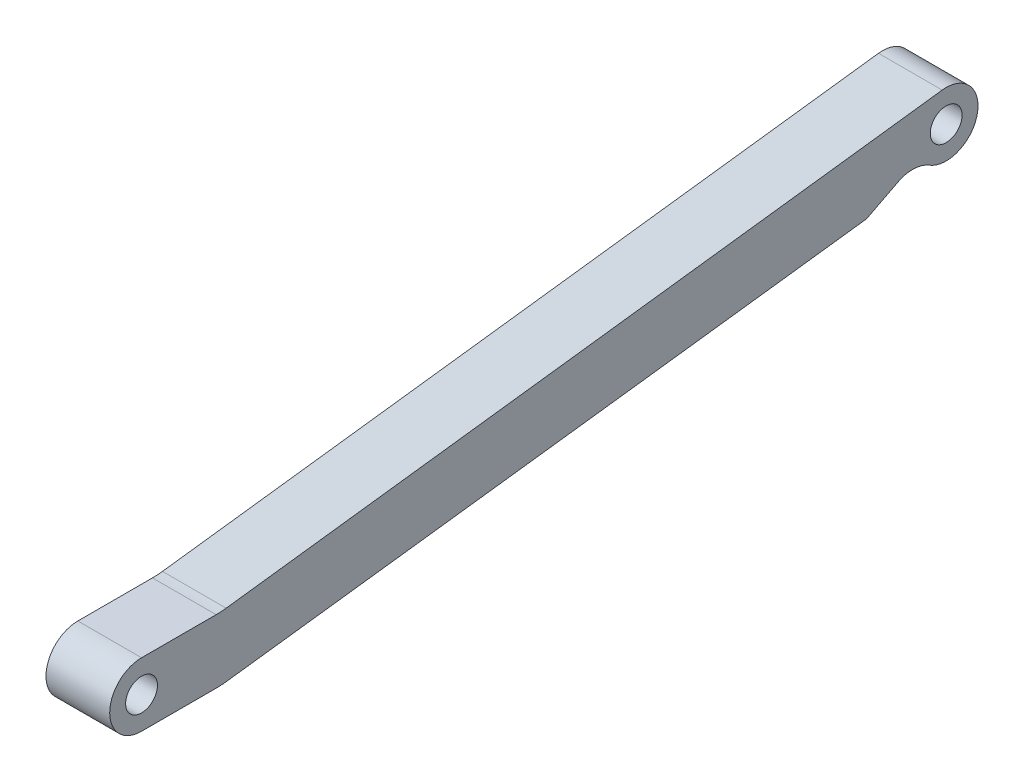
ISO-10303-21;
HEADER;
FILE_DESCRIPTION(('STEP AP214'),'2;1');
FILE_NAME('part.step','',(''),(''),'','','');
FILE_SCHEMA(('AUTOMOTIVE_DESIGN { 1 0 10303 214 1 1 1 1 }'));
ENDSEC;
DATA;
#1=APPLICATION_CONTEXT('core data for automotive mechanical design processes');
#2=APPLICATION_PROTOCOL_DEFINITION('international standard','automotive_design',2000,#1);
#3=PRODUCT_CONTEXT('',#1,'mechanical');
#4=PRODUCT('Part','Part','',(#3));
#5=PRODUCT_RELATED_PRODUCT_CATEGORY('part','',(#4));
#6=PRODUCT_DEFINITION_FORMATION('','',#4);
#7=PRODUCT_DEFINITION_CONTEXT('part definition',#1,'design');
#8=PRODUCT_DEFINITION('design','',#6,#7);
#9=PRODUCT_DEFINITION_SHAPE('','',#8);
#10=(LENGTH_UNIT() NAMED_UNIT(*) SI_UNIT(.MILLI.,.METRE.));
#11=(NAMED_UNIT(*) PLANE_ANGLE_UNIT() SI_UNIT($,.RADIAN.));
#12=(NAMED_UNIT(*) SI_UNIT($,.STERADIAN.) SOLID_ANGLE_UNIT());
#13=UNCERTAINTY_MEASURE_WITH_UNIT(LENGTH_MEASURE(1.E-05),#10,'distance_accuracy_value','');
#14=(GEOMETRIC_REPRESENTATION_CONTEXT(3) GLOBAL_UNCERTAINTY_ASSIGNED_CONTEXT((#13)) GLOBAL_UNIT_ASSIGNED_CONTEXT((#10,
#11,#12)) REPRESENTATION_CONTEXT('',''));
#15=CARTESIAN_POINT('',(0.,0.,0.));
#16=DIRECTION('',(0.,0.,1.));
#17=DIRECTION('',(1.,0.,0.));
#18=AXIS2_PLACEMENT_3D('',#15,#16,#17);
#19=CARTESIAN_POINT('',(-2.,-1.6545990799385,-48.4277662077511));
#20=DIRECTION('',(1.,0.,0.));
#21=DIRECTION('',(0.,0.,-1.));
#22=AXIS2_PLACEMENT_3D('',#19,#20,#21);
#23=CYLINDRICAL_SURFACE('',#22,2.);
#24=DIRECTION('',(1.,0.,0.));
#25=VECTOR('',#24,1.);
#26=CARTESIAN_POINT('',(-2.,0.0477004600307523,-49.4776120422528));
#27=LINE('',#26,#25);
#28=CARTESIAN_POINT('',(-2.,0.0477004600307523,-49.4776120422528));
#29=VERTEX_POINT('',#28);
#30=CARTESIAN_POINT('',(2.,0.0477004600307523,-49.4776120422528));
#31=VERTEX_POINT('',#30);
#32=EDGE_CURVE('E42',#29,#31,#27,.T.);
#33=ORIENTED_EDGE('',*,*,#32,.T.);
#34=CARTESIAN_POINT('',(2.,-1.6545990799385,-48.4277662077511));
#35=DIRECTION('',(1.,0.,0.));
#36=DIRECTION('',(0.,0.,-1.));
#37=AXIS2_PLACEMENT_3D('',#34,#35,#36);
#38=CIRCLE('',#37,2.);
#39=CARTESIAN_POINT('',(2.,0.124574628471132,-47.5142340981327));
#40=VERTEX_POINT('',#39);
#41=EDGE_CURVE('E119',#31,#40,#38,.T.);
#42=ORIENTED_EDGE('',*,*,#41,.T.);
#43=DIRECTION('',(1.,0.,0.));
#44=VECTOR('',#43,1.);
#45=CARTESIAN_POINT('',(-2.,0.124574628471132,-47.5142340981327));
#46=LINE('',#45,#44);
#47=CARTESIAN_POINT('',(-2.,0.124574628471132,-47.5142340981327));
#48=VERTEX_POINT('',#47);
#49=EDGE_CURVE('E11',#48,#40,#46,.T.);
#50=ORIENTED_EDGE('',*,*,#49,.F.);
#51=CARTESIAN_POINT('',(-2.,-1.6545990799385,-48.4277662077511));
#52=DIRECTION('',(1.,0.,0.));
#53=DIRECTION('',(0.,0.,-1.));
#54=AXIS2_PLACEMENT_3D('',#51,#52,#53);
#55=CIRCLE('',#54,2.);
#56=EDGE_CURVE('E55',#29,#48,#55,.T.);
#57=ORIENTED_EDGE('',*,*,#56,.F.);
#58=EDGE_LOOP('',(#33,#42,#50,#57));
#59=FACE_BOUND('',#58,.T.);
#60=ADVANCED_FACE('F39',(#59),#23,.F.);
#61=CARTESIAN_POINT('',(-2.,-19.2080210083008,-9.86252431135217));
#62=DIRECTION('',(0.,-0.889586854204813,-0.456766054809225));
#63=DIRECTION('',(0.,0.456766054809225,-0.889586854204813));
#64=AXIS2_PLACEMENT_3D('',#61,#62,#63);
#65=PLANE('',#64);
#66=ORIENTED_EDGE('',*,*,#49,.T.);
#67=DIRECTION('',(0.,0.456766054809225,-0.889586854204813));
#68=VECTOR('',#67,1.);
#69=CARTESIAN_POINT('',(2.,-19.2080210083008,-9.86252431135217));
#70=LINE('',#69,#68);
#71=CARTESIAN_POINT('',(2.,-0.895552784763757,-45.5274578767545));
#72=VERTEX_POINT('',#71);
#73=EDGE_CURVE('E137',#72,#40,#70,.T.);
#74=ORIENTED_EDGE('',*,*,#73,.F.);
#75=DIRECTION('',(1.,0.,0.));
#76=VECTOR('',#75,1.);
#77=CARTESIAN_POINT('',(-2.,-0.895552784763757,-45.5274578767545));
#78=LINE('',#77,#76);
#79=CARTESIAN_POINT('',(-2.,-0.895552784763757,-45.5274578767545));
#80=VERTEX_POINT('',#79);
#81=EDGE_CURVE('E47',#80,#72,#78,.T.);
#82=ORIENTED_EDGE('',*,*,#81,.F.);
#83=DIRECTION('',(0.,0.456766054809225,-0.889586854204813));
#84=VECTOR('',#83,1.);
#85=CARTESIAN_POINT('',(-2.,-19.2080210083008,-9.86252431135217));
#86=LINE('',#85,#84);
#87=EDGE_CURVE('E185',#80,#48,#86,.T.);
#88=ORIENTED_EDGE('',*,*,#87,.T.);
#89=EDGE_LOOP('',(#66,#74,#82,#88));
#90=FACE_BOUND('',#89,.T.);
#91=ADVANCED_FACE('F234',(#90),#65,.T.);
#92=CARTESIAN_POINT('',(-2.,-6.52622304767689,-0.821980030502535));
#93=DIRECTION('',(0.,-0.992161393976565,-0.124963067753959));
#94=DIRECTION('',(0.,0.124963067753959,-0.992161393976565));
#95=AXIS2_PLACEMENT_3D('',#92,#93,#94);
#96=PLANE('',#95);
#97=ORIENTED_EDGE('',*,*,#81,.T.);
#98=DIRECTION('',(0.,0.124963067753959,-0.992161393976564));
#99=VECTOR('',#98,1.);
#100=CARTESIAN_POINT('',(2.,-6.52622304767689,-0.821980030502535));
#101=LINE('',#100,#99);
#102=CARTESIAN_POINT('',(2.,-5.96080696988282,-5.31117843130884));
#103=VERTEX_POINT('',#102);
#104=EDGE_CURVE('E156',#103,#72,#101,.T.);
#105=ORIENTED_EDGE('',*,*,#104,.F.);
#106=DIRECTION('',(1.,0.,0.));
#107=VECTOR('',#106,1.);
#108=CARTESIAN_POINT('',(-2.,-5.96080696988282,-5.31117843130884));
#109=LINE('',#108,#107);
#110=CARTESIAN_POINT('',(-2.,-5.96080696988282,-5.31117843130884));
#111=VERTEX_POINT('',#110);
#112=EDGE_CURVE('E193',#111,#103,#109,.T.);
#113=ORIENTED_EDGE('',*,*,#112,.F.);
#114=DIRECTION('',(0.,0.124963067753959,-0.992161393976564));
#115=VECTOR('',#114,1.);
#116=CARTESIAN_POINT('',(-2.,-6.52622304767689,-0.821980030502535));
#117=LINE('',#116,#115);
#118=EDGE_CURVE('E183',#111,#80,#117,.T.);
#119=ORIENTED_EDGE('',*,*,#118,.T.);
#120=EDGE_LOOP('',(#97,#105,#113,#119));
#121=FACE_BOUND('',#120,.T.);
#122=ADVANCED_FACE('F232',(#121),#96,.T.);
#123=CARTESIAN_POINT('',(-2.,-1.,-4.68636309253905));
#124=DIRECTION('',(1.,0.,0.));
#125=DIRECTION('',(0.,0.,-1.));
#126=AXIS2_PLACEMENT_3D('',#123,#124,#125);
#127=CYLINDRICAL_SURFACE('',#126,5.);
#128=ORIENTED_EDGE('',*,*,#112,.T.);
#129=CARTESIAN_POINT('',(2.,-1.,-4.68636309253905));
#130=DIRECTION('',(1.,0.,0.));
#131=DIRECTION('',(0.,0.,-1.));
#132=AXIS2_PLACEMENT_3D('',#129,#130,#131);
#133=CIRCLE('',#132,5.);
#134=CARTESIAN_POINT('',(2.,-6.,-4.68636309253905));
#135=VERTEX_POINT('',#134);
#136=EDGE_CURVE('E153',#135,#103,#133,.T.);
#137=ORIENTED_EDGE('',*,*,#136,.F.);
#138=DIRECTION('',(1.,0.,0.));
#139=VECTOR('',#138,1.);
#140=CARTESIAN_POINT('',(-2.,-6.,-4.68636309253905));
#141=LINE('',#140,#139);
#142=CARTESIAN_POINT('',(-2.,-6.,-4.68636309253905));
#143=VERTEX_POINT('',#142);
#144=EDGE_CURVE('E195',#143,#135,#141,.T.);
#145=ORIENTED_EDGE('',*,*,#144,.F.);
#146=CARTESIAN_POINT('',(-2.,-1.,-4.68636309253905));
#147=DIRECTION('',(1.,0.,0.));
#148=DIRECTION('',(0.,0.,-1.));
#149=AXIS2_PLACEMENT_3D('',#146,#147,#148);
#150=CIRCLE('',#149,5.);
#151=EDGE_CURVE('E180',#143,#111,#150,.T.);
#152=ORIENTED_EDGE('',*,*,#151,.T.);
#153=EDGE_LOOP('',(#128,#137,#145,#152));
#154=FACE_BOUND('',#153,.T.);
#155=ADVANCED_FACE('F227',(#154),#127,.T.);
#156=CARTESIAN_POINT('',(-2.,-6.,0.));
#157=DIRECTION('',(0.,-1.,0.));
#158=DIRECTION('',(0.,0.,-1.));
#159=AXIS2_PLACEMENT_3D('',#156,#157,#158);
#160=PLANE('',#159);
#161=ORIENTED_EDGE('',*,*,#144,.T.);
#162=DIRECTION('',(0.,0.,-1.));
#163=VECTOR('',#162,1.);
#164=CARTESIAN_POINT('',(2.,-6.,0.));
#165=LINE('',#164,#163);
#166=CARTESIAN_POINT('',(2.,-6.,0.));
#167=VERTEX_POINT('',#166);
#168=EDGE_CURVE('E150',#167,#135,#165,.T.);
#169=ORIENTED_EDGE('',*,*,#168,.F.);
#170=DIRECTION('',(1.,0.,0.));
#171=VECTOR('',#170,1.);
#172=CARTESIAN_POINT('',(-2.,-6.,0.));
#173=LINE('',#172,#171);
#174=CARTESIAN_POINT('',(-2.,-6.,0.));
#175=VERTEX_POINT('',#174);
#176=EDGE_CURVE('E197',#175,#167,#173,.T.);
#177=ORIENTED_EDGE('',*,*,#176,.F.);
#178=DIRECTION('',(0.,0.,-1.));
#179=VECTOR('',#178,1.);
#180=CARTESIAN_POINT('',(-2.,-6.,0.));
#181=LINE('',#180,#179);
#182=EDGE_CURVE('E177',#175,#143,#181,.T.);
#183=ORIENTED_EDGE('',*,*,#182,.T.);
#184=EDGE_LOOP('',(#161,#169,#177,#183));
#185=FACE_BOUND('',#184,.T.);
#186=ADVANCED_FACE('F223',(#185),#160,.T.);
#187=CARTESIAN_POINT('',(-2.,-4.,0.));
#188=DIRECTION('',(1.,0.,0.));
#189=DIRECTION('',(0.,0.,-1.));
#190=AXIS2_PLACEMENT_3D('',#187,#188,#189);
#191=CYLINDRICAL_SURFACE('',#190,2.);
#192=ORIENTED_EDGE('',*,*,#176,.T.);
#193=CARTESIAN_POINT('',(2.,-4.,0.));
#194=DIRECTION('',(1.,0.,0.));
#195=DIRECTION('',(0.,0.,-1.));
#196=AXIS2_PLACEMENT_3D('',#193,#194,#195);
#197=CIRCLE('',#196,2.);
#198=CARTESIAN_POINT('',(2.,-2.,0.));
#199=VERTEX_POINT('',#198);
#200=EDGE_CURVE('E147',#199,#167,#197,.T.);
#201=ORIENTED_EDGE('',*,*,#200,.F.);
#202=DIRECTION('',(1.,0.,0.));
#203=VECTOR('',#202,1.);
#204=CARTESIAN_POINT('',(-2.,-2.,0.));
#205=LINE('',#204,#203);
#206=CARTESIAN_POINT('',(-2.,-2.,0.));
#207=VERTEX_POINT('',#206);
#208=EDGE_CURVE('E199',#207,#199,#205,.T.);
#209=ORIENTED_EDGE('',*,*,#208,.F.);
#210=CARTESIAN_POINT('',(-2.,-4.,0.));
#211=DIRECTION('',(1.,0.,0.));
#212=DIRECTION('',(0.,0.,-1.));
#213=AXIS2_PLACEMENT_3D('',#210,#211,#212);
#214=CIRCLE('',#213,2.);
#215=EDGE_CURVE('E174',#207,#175,#214,.T.);
#216=ORIENTED_EDGE('',*,*,#215,.T.);
#217=EDGE_LOOP('',(#192,#201,#209,#216));
#218=FACE_BOUND('',#217,.T.);
#219=ADVANCED_FACE('F250',(#218),#191,.T.);
#220=CARTESIAN_POINT('',(-2.,-2.,0.));
#221=DIRECTION('',(0.,-1.,0.));
#222=DIRECTION('',(0.,0.,-1.));
#223=AXIS2_PLACEMENT_3D('',#220,#221,#222);
#224=PLANE('',#223);
#225=ORIENTED_EDGE('',*,*,#208,.T.);
#226=DIRECTION('',(0.,0.,-1.));
#227=VECTOR('',#226,1.);
#228=CARTESIAN_POINT('',(2.,-2.,0.));
#229=LINE('',#228,#227);
#230=CARTESIAN_POINT('',(2.,-2.,-4.68463875549946));
#231=VERTEX_POINT('',#230);
#232=EDGE_CURVE('E144',#199,#231,#229,.T.);
#233=ORIENTED_EDGE('',*,*,#232,.T.);
#234=DIRECTION('',(1.,0.,0.));
#235=VECTOR('',#234,1.);
#236=CARTESIAN_POINT('',(-2.,-2.,-4.68463875549946));
#237=LINE('',#236,#235);
#238=CARTESIAN_POINT('',(-2.,-2.,-4.68463875549946));
#239=VERTEX_POINT('',#238);
#240=EDGE_CURVE('E201',#239,#231,#237,.T.);
#241=ORIENTED_EDGE('',*,*,#240,.F.);
#242=DIRECTION('',(0.,0.,-1.));
#243=VECTOR('',#242,1.);
#244=CARTESIAN_POINT('',(-2.,-2.,0.));
#245=LINE('',#244,#243);
#246=EDGE_CURVE('E172',#207,#239,#245,.T.);
#247=ORIENTED_EDGE('',*,*,#246,.F.);
#248=EDGE_LOOP('',(#225,#233,#241,#247));
#249=FACE_BOUND('',#248,.T.);
#250=ADVANCED_FACE('F216',(#249),#224,.F.);
#251=CARTESIAN_POINT('',(-2.,3.,-4.68463875549946));
#252=DIRECTION('',(1.,0.,0.));
#253=DIRECTION('',(0.,0.,-1.));
#254=AXIS2_PLACEMENT_3D('',#251,#252,#253);
#255=CYLINDRICAL_SURFACE('',#254,5.);
#256=ORIENTED_EDGE('',*,*,#240,.T.);
#257=CARTESIAN_POINT('',(2.,3.,-4.68463875549946));
#258=DIRECTION('',(1.,0.,0.));
#259=DIRECTION('',(0.,0.,-1.));
#260=AXIS2_PLACEMENT_3D('',#257,#258,#259);
#261=CIRCLE('',#260,5.);
#262=CARTESIAN_POINT('',(2.,-1.96037654061066,-5.31286210380755));
#263=VERTEX_POINT('',#262);
#264=EDGE_CURVE('E141',#231,#263,#261,.T.);
#265=ORIENTED_EDGE('',*,*,#264,.T.);
#266=DIRECTION('',(1.,0.,0.));
#267=VECTOR('',#266,1.);
#268=CARTESIAN_POINT('',(-2.,-1.96037654061066,-5.31286210380755));
#269=LINE('',#268,#267);
#270=CARTESIAN_POINT('',(-2.,-1.96037654061066,-5.31286210380755));
#271=VERTEX_POINT('',#270);
#272=EDGE_CURVE('E203',#271,#263,#269,.T.);
#273=ORIENTED_EDGE('',*,*,#272,.F.);
#274=CARTESIAN_POINT('',(-2.,3.,-4.68463875549946));
#275=DIRECTION('',(1.,0.,0.));
#276=DIRECTION('',(0.,0.,-1.));
#277=AXIS2_PLACEMENT_3D('',#274,#275,#276);
#278=CIRCLE('',#277,5.);
#279=EDGE_CURVE('E170',#239,#271,#278,.T.);
#280=ORIENTED_EDGE('',*,*,#279,.F.);
#281=EDGE_LOOP('',(#256,#265,#273,#280));
#282=FACE_BOUND('',#281,.T.);
#283=ADVANCED_FACE('F212',(#282),#255,.F.);
#284=CARTESIAN_POINT('',(-2.,-2.5916717058135,-0.328230863808787));
#285=DIRECTION('',(0.,-0.992075308122132,-0.125644669661617));
#286=DIRECTION('',(0.,0.125644669661617,-0.992075308122132));
#287=AXIS2_PLACEMENT_3D('',#284,#285,#286);
#288=PLANE('',#287);
#289=ORIENTED_EDGE('',*,*,#272,.T.);
#290=DIRECTION('',(0.,0.125644669661617,-0.992075308122132));
#291=VECTOR('',#290,1.);
#292=CARTESIAN_POINT('',(2.,-2.5916717058135,-0.328230863808787));
#293=LINE('',#292,#291);
#294=CARTESIAN_POINT('',(2.,3.73415061624427,-50.2761685374312));
#295=VERTEX_POINT('',#294);
#296=EDGE_CURVE('E131',#263,#295,#293,.T.);
#297=ORIENTED_EDGE('',*,*,#296,.T.);
#298=DIRECTION('',(1.,0.,0.));
#299=VECTOR('',#298,1.);
#300=CARTESIAN_POINT('',(-2.,3.73415061624427,-50.2761685374312));
#301=LINE('',#300,#299);
#302=CARTESIAN_POINT('',(-2.,3.73415061624427,-50.2761685374312));
#303=VERTEX_POINT('',#302);
#304=EDGE_CURVE('E122',#303,#295,#301,.T.);
#305=ORIENTED_EDGE('',*,*,#304,.F.);
#306=DIRECTION('',(0.,0.125644669661617,-0.992075308122132));
#307=VECTOR('',#306,1.);
#308=CARTESIAN_POINT('',(-2.,-2.5916717058135,-0.328230863808787));
#309=LINE('',#308,#307);
#310=EDGE_CURVE('E168',#271,#303,#309,.T.);
#311=ORIENTED_EDGE('',*,*,#310,.F.);
#312=EDGE_LOOP('',(#289,#297,#305,#311));
#313=FACE_BOUND('',#312,.T.);
#314=ADVANCED_FACE('F207',(#313),#288,.F.);
#315=CARTESIAN_POINT('',(-2.,-4.,0.));
#316=DIRECTION('',(1.,0.,0.));
#317=DIRECTION('',(0.,0.,-1.));
#318=AXIS2_PLACEMENT_3D('',#315,#316,#317);
#319=CYLINDRICAL_SURFACE('',#318,1.);
#320=CARTESIAN_POINT('',(-2.,-4.,0.));
#321=DIRECTION('',(1.,0.,0.));
#322=DIRECTION('',(0.,0.,-1.));
#323=AXIS2_PLACEMENT_3D('',#320,#321,#322);
#324=CIRCLE('',#323,1.);
#325=CARTESIAN_POINT('',(-2.,-4.,-0.999999999999951));
#326=VERTEX_POINT('',#325);
#327=EDGE_CURVE('E187',#326,#326,#324,.T.);
#328=ORIENTED_EDGE('',*,*,#327,.F.);
#329=EDGE_LOOP('',(#328));
#330=FACE_BOUND('',#329,.T.);
#331=CARTESIAN_POINT('',(2.,-4.,0.));
#332=DIRECTION('',(1.,0.,0.));
#333=DIRECTION('',(0.,0.,-1.));
#334=AXIS2_PLACEMENT_3D('',#331,#332,#333);
#335=CIRCLE('',#334,1.);
#336=CARTESIAN_POINT('',(2.,-4.,-0.999999999999951));
#337=VERTEX_POINT('',#336);
#338=EDGE_CURVE('E159',#337,#337,#335,.T.);
#339=ORIENTED_EDGE('',*,*,#338,.T.);
#340=EDGE_LOOP('',(#339));
#341=FACE_BOUND('',#340,.T.);
#342=ADVANCED_FACE('F243',(#330,#341),#319,.F.);
#343=CARTESIAN_POINT('',(-2.,1.75,-50.5274578767545));
#344=DIRECTION('',(1.,0.,0.));
#345=DIRECTION('',(0.,0.,-1.));
#346=AXIS2_PLACEMENT_3D('',#343,#344,#345);
#347=CYLINDRICAL_SURFACE('',#346,2.);
#348=ORIENTED_EDGE('',*,*,#304,.T.);
#349=CARTESIAN_POINT('',(2.,1.75,-50.5274578767545));
#350=DIRECTION('',(1.,0.,0.));
#351=DIRECTION('',(0.,0.,-1.));
#352=AXIS2_PLACEMENT_3D('',#349,#350,#351);
#353=CIRCLE('',#352,2.);
#354=EDGE_CURVE('E125',#31,#295,#353,.T.);
#355=ORIENTED_EDGE('',*,*,#354,.F.);
#356=ORIENTED_EDGE('',*,*,#32,.F.);
#357=CARTESIAN_POINT('',(-2.,1.75,-50.5274578767545));
#358=DIRECTION('',(1.,0.,0.));
#359=DIRECTION('',(0.,0.,-1.));
#360=AXIS2_PLACEMENT_3D('',#357,#358,#359);
#361=CIRCLE('',#360,2.);
#362=EDGE_CURVE('E166',#29,#303,#361,.T.);
#363=ORIENTED_EDGE('',*,*,#362,.T.);
#364=EDGE_LOOP('',(#348,#355,#356,#363));
#365=FACE_BOUND('',#364,.T.);
#366=ADVANCED_FACE('F126',(#365),#347,.T.);
#367=CARTESIAN_POINT('',(-2.,1.75,-50.5274578767545));
#368=DIRECTION('',(1.,0.,0.));
#369=DIRECTION('',(0.,0.,-1.));
#370=AXIS2_PLACEMENT_3D('',#367,#368,#369);
#371=CYLINDRICAL_SURFACE('',#370,0.999999999999998);
#372=CARTESIAN_POINT('',(-2.,1.75,-50.5274578767545));
#373=DIRECTION('',(1.,0.,0.));
#374=DIRECTION('',(0.,0.,-1.));
#375=AXIS2_PLACEMENT_3D('',#372,#373,#374);
#376=CIRCLE('',#375,0.999999999999998);
#377=CARTESIAN_POINT('',(-2.,1.75,-51.5274578767545));
#378=VERTEX_POINT('',#377);
#379=EDGE_CURVE('E123',#378,#378,#376,.T.);
#380=ORIENTED_EDGE('',*,*,#379,.F.);
#381=EDGE_LOOP('',(#380));
#382=FACE_BOUND('',#381,.T.);
#383=CARTESIAN_POINT('',(2.,1.75,-50.5274578767545));
#384=DIRECTION('',(1.,0.,0.));
#385=DIRECTION('',(0.,0.,-1.));
#386=AXIS2_PLACEMENT_3D('',#383,#384,#385);
#387=CIRCLE('',#386,0.999999999999998);
#388=CARTESIAN_POINT('',(2.,1.75,-51.5274578767545));
#389=VERTEX_POINT('',#388);
#390=EDGE_CURVE('E162',#389,#389,#387,.T.);
#391=ORIENTED_EDGE('',*,*,#390,.T.);
#392=EDGE_LOOP('',(#391));
#393=FACE_BOUND('',#392,.T.);
#394=ADVANCED_FACE('F259',(#382,#393),#371,.F.);
#395=CARTESIAN_POINT('',(-2.,0.,0.));
#396=DIRECTION('',(1.,0.,0.));
#397=DIRECTION('',(0.,0.,-1.));
#398=AXIS2_PLACEMENT_3D('',#395,#396,#397);
#399=PLANE('',#398);
#400=ORIENTED_EDGE('',*,*,#56,.T.);
#401=ORIENTED_EDGE('',*,*,#87,.F.);
#402=ORIENTED_EDGE('',*,*,#118,.F.);
#403=ORIENTED_EDGE('',*,*,#151,.F.);
#404=ORIENTED_EDGE('',*,*,#182,.F.);
#405=ORIENTED_EDGE('',*,*,#215,.F.);
#406=ORIENTED_EDGE('',*,*,#246,.T.);
#407=ORIENTED_EDGE('',*,*,#279,.T.);
#408=ORIENTED_EDGE('',*,*,#310,.T.);
#409=ORIENTED_EDGE('',*,*,#362,.F.);
#410=EDGE_LOOP('',(#400,#401,#402,#403,#404,#405,#406,#407,#408,#409));
#411=FACE_BOUND('',#410,.T.);
#412=ORIENTED_EDGE('',*,*,#327,.T.);
#413=EDGE_LOOP('',(#412));
#414=FACE_BOUND('',#413,.T.);
#415=ORIENTED_EDGE('',*,*,#379,.T.);
#416=EDGE_LOOP('',(#415));
#417=FACE_BOUND('',#416,.T.);
#418=ADVANCED_FACE('F229',(#411,#414,#417),#399,.F.);
#419=CARTESIAN_POINT('',(2.,0.,0.));
#420=DIRECTION('',(1.,0.,0.));
#421=DIRECTION('',(0.,0.,-1.));
#422=AXIS2_PLACEMENT_3D('',#419,#420,#421);
#423=PLANE('',#422);
#424=ORIENTED_EDGE('',*,*,#41,.F.);
#425=ORIENTED_EDGE('',*,*,#354,.T.);
#426=ORIENTED_EDGE('',*,*,#296,.F.);
#427=ORIENTED_EDGE('',*,*,#264,.F.);
#428=ORIENTED_EDGE('',*,*,#232,.F.);
#429=ORIENTED_EDGE('',*,*,#200,.T.);
#430=ORIENTED_EDGE('',*,*,#168,.T.);
#431=ORIENTED_EDGE('',*,*,#136,.T.);
#432=ORIENTED_EDGE('',*,*,#104,.T.);
#433=ORIENTED_EDGE('',*,*,#73,.T.);
#434=EDGE_LOOP('',(#424,#425,#426,#427,#428,#429,#430,#431,#432,#433));
#435=FACE_BOUND('',#434,.T.);
#436=ORIENTED_EDGE('',*,*,#338,.F.);
#437=EDGE_LOOP('',(#436));
#438=FACE_BOUND('',#437,.T.);
#439=ORIENTED_EDGE('',*,*,#390,.F.);
#440=EDGE_LOOP('',(#439));
#441=FACE_BOUND('',#440,.T.);
#442=ADVANCED_FACE('F134',(#435,#438,#441),#423,.T.);
#443=CLOSED_SHELL('',(#60,#91,#122,#155,#186,#219,#250,#283,#314,#342,#366,#394,#418,#442));
#444=MANIFOLD_SOLID_BREP('B2',#443);
#445=ADVANCED_BREP_SHAPE_REPRESENTATION('',(#18,#444),#14);
#446=SHAPE_DEFINITION_REPRESENTATION(#9,#445);
ENDSEC;
END-ISO-10303-21;
